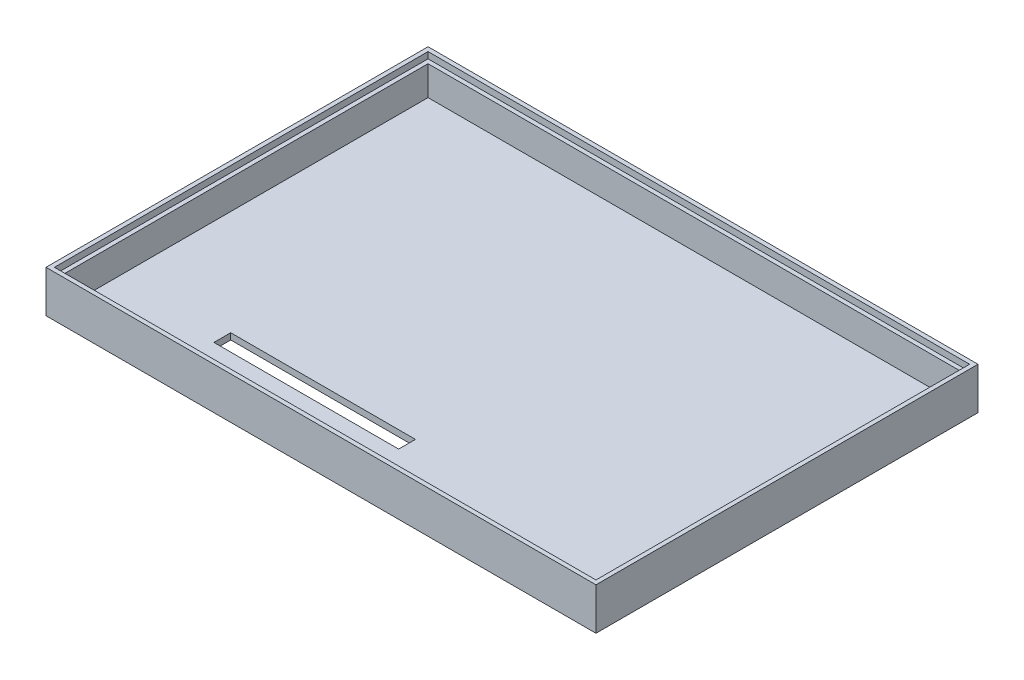
ISO-10303-21;
HEADER;
FILE_DESCRIPTION(('STEP AP214'),'2;1');
FILE_NAME('part.step','',(''),(''),'','','');
FILE_SCHEMA(('AUTOMOTIVE_DESIGN { 1 0 10303 214 1 1 1 1 }'));
ENDSEC;
DATA;
#1=APPLICATION_CONTEXT('core data for automotive mechanical design processes');
#2=APPLICATION_PROTOCOL_DEFINITION('international standard','automotive_design',2000,#1);
#3=PRODUCT_CONTEXT('',#1,'mechanical');
#4=PRODUCT('Part','Part','',(#3));
#5=PRODUCT_RELATED_PRODUCT_CATEGORY('part','',(#4));
#6=PRODUCT_DEFINITION_FORMATION('','',#4);
#7=PRODUCT_DEFINITION_CONTEXT('part definition',#1,'design');
#8=PRODUCT_DEFINITION('design','',#6,#7);
#9=PRODUCT_DEFINITION_SHAPE('','',#8);
#10=(LENGTH_UNIT() NAMED_UNIT(*) SI_UNIT(.MILLI.,.METRE.));
#11=(NAMED_UNIT(*) PLANE_ANGLE_UNIT() SI_UNIT($,.RADIAN.));
#12=(NAMED_UNIT(*) SI_UNIT($,.STERADIAN.) SOLID_ANGLE_UNIT());
#13=UNCERTAINTY_MEASURE_WITH_UNIT(LENGTH_MEASURE(1.E-05),#10,'distance_accuracy_value','');
#14=(GEOMETRIC_REPRESENTATION_CONTEXT(3) GLOBAL_UNCERTAINTY_ASSIGNED_CONTEXT((#13)) GLOBAL_UNIT_ASSIGNED_CONTEXT((#10,
#11,#12)) REPRESENTATION_CONTEXT('',''));
#15=CARTESIAN_POINT('',(0.,0.,0.));
#16=DIRECTION('',(0.,0.,1.));
#17=DIRECTION('',(1.,0.,0.));
#18=AXIS2_PLACEMENT_3D('',#15,#16,#17);
#19=CARTESIAN_POINT('',(-63.5,10.,-43.5));
#20=DIRECTION('',(1.,0.,0.));
#21=DIRECTION('',(0.,0.,-1.));
#22=AXIS2_PLACEMENT_3D('',#19,#20,#21);
#23=PLANE('',#22);
#24=DIRECTION('',(0.,-1.,0.));
#25=VECTOR('',#24,1.);
#26=CARTESIAN_POINT('',(-63.5,10.,-43.5));
#27=LINE('',#26,#25);
#28=CARTESIAN_POINT('',(-63.5,8.5,-43.5));
#29=VERTEX_POINT('',#28);
#30=CARTESIAN_POINT('',(-63.5,1.5,-43.5));
#31=VERTEX_POINT('',#30);
#32=EDGE_CURVE('E158',#29,#31,#27,.T.);
#33=ORIENTED_EDGE('',*,*,#32,.F.);
#34=DIRECTION('',(0.,0.,1.));
#35=VECTOR('',#34,1.);
#36=CARTESIAN_POINT('',(-63.5,8.5,-43.5));
#37=LINE('',#36,#35);
#38=CARTESIAN_POINT('',(-63.5,8.5,43.5));
#39=VERTEX_POINT('',#38);
#40=EDGE_CURVE('E48',#29,#39,#37,.T.);
#41=ORIENTED_EDGE('',*,*,#40,.T.);
#42=DIRECTION('',(0.,-1.,0.));
#43=VECTOR('',#42,1.);
#44=CARTESIAN_POINT('',(-63.5,10.,43.5));
#45=LINE('',#44,#43);
#46=CARTESIAN_POINT('',(-63.5,1.5,43.5));
#47=VERTEX_POINT('',#46);
#48=EDGE_CURVE('E156',#39,#47,#45,.T.);
#49=ORIENTED_EDGE('',*,*,#48,.T.);
#50=DIRECTION('',(0.,0.,1.));
#51=VECTOR('',#50,1.);
#52=CARTESIAN_POINT('',(-63.5,1.5,43.5));
#53=LINE('',#52,#51);
#54=EDGE_CURVE('E41',#31,#47,#53,.T.);
#55=ORIENTED_EDGE('',*,*,#54,.F.);
#56=EDGE_LOOP('',(#33,#41,#49,#55));
#57=FACE_BOUND('',#56,.T.);
#58=ADVANCED_FACE('F33',(#57),#23,.T.);
#59=CARTESIAN_POINT('',(-63.5,10.,43.5));
#60=DIRECTION('',(0.,0.,-1.));
#61=DIRECTION('',(-1.,0.,0.));
#62=AXIS2_PLACEMENT_3D('',#59,#60,#61);
#63=PLANE('',#62);
#64=ORIENTED_EDGE('',*,*,#48,.F.);
#65=DIRECTION('',(1.,0.,0.));
#66=VECTOR('',#65,1.);
#67=CARTESIAN_POINT('',(-63.5,8.5,43.5));
#68=LINE('',#67,#66);
#69=CARTESIAN_POINT('',(63.5,8.5,43.5));
#70=VERTEX_POINT('',#69);
#71=EDGE_CURVE('E144',#39,#70,#68,.T.);
#72=ORIENTED_EDGE('',*,*,#71,.T.);
#73=DIRECTION('',(0.,-1.,0.));
#74=VECTOR('',#73,1.);
#75=CARTESIAN_POINT('',(63.5,10.,43.5));
#76=LINE('',#75,#74);
#77=CARTESIAN_POINT('',(63.5,1.5,43.5));
#78=VERTEX_POINT('',#77);
#79=EDGE_CURVE('E163',#70,#78,#76,.T.);
#80=ORIENTED_EDGE('',*,*,#79,.T.);
#81=DIRECTION('',(1.,0.,0.));
#82=VECTOR('',#81,1.);
#83=CARTESIAN_POINT('',(-63.5,1.5,43.5));
#84=LINE('',#83,#82);
#85=EDGE_CURVE('E11',#47,#78,#84,.T.);
#86=ORIENTED_EDGE('',*,*,#85,.F.);
#87=EDGE_LOOP('',(#64,#72,#80,#86));
#88=FACE_BOUND('',#87,.T.);
#89=ADVANCED_FACE('F160',(#88),#63,.T.);
#90=CARTESIAN_POINT('',(63.5,10.,43.5));
#91=DIRECTION('',(-1.,0.,0.));
#92=DIRECTION('',(0.,0.,1.));
#93=AXIS2_PLACEMENT_3D('',#90,#91,#92);
#94=PLANE('',#93);
#95=ORIENTED_EDGE('',*,*,#79,.F.);
#96=DIRECTION('',(0.,0.,-1.));
#97=VECTOR('',#96,1.);
#98=CARTESIAN_POINT('',(63.5,8.5,43.5));
#99=LINE('',#98,#97);
#100=CARTESIAN_POINT('',(63.5,8.5,-43.5));
#101=VERTEX_POINT('',#100);
#102=EDGE_CURVE('E148',#70,#101,#99,.T.);
#103=ORIENTED_EDGE('',*,*,#102,.T.);
#104=DIRECTION('',(0.,-1.,0.));
#105=VECTOR('',#104,1.);
#106=CARTESIAN_POINT('',(63.5,10.,-43.5));
#107=LINE('',#106,#105);
#108=CARTESIAN_POINT('',(63.5,1.5,-43.5));
#109=VERTEX_POINT('',#108);
#110=EDGE_CURVE('E168',#101,#109,#107,.T.);
#111=ORIENTED_EDGE('',*,*,#110,.T.);
#112=DIRECTION('',(0.,0.,-1.));
#113=VECTOR('',#112,1.);
#114=CARTESIAN_POINT('',(63.5,1.5,43.5));
#115=LINE('',#114,#113);
#116=EDGE_CURVE('E198',#78,#109,#115,.T.);
#117=ORIENTED_EDGE('',*,*,#116,.F.);
#118=EDGE_LOOP('',(#95,#103,#111,#117));
#119=FACE_BOUND('',#118,.T.);
#120=ADVANCED_FACE('F276',(#119),#94,.T.);
#121=CARTESIAN_POINT('',(63.5,10.,-43.5));
#122=DIRECTION('',(0.,0.,1.));
#123=DIRECTION('',(1.,0.,0.));
#124=AXIS2_PLACEMENT_3D('',#121,#122,#123);
#125=PLANE('',#124);
#126=ORIENTED_EDGE('',*,*,#110,.F.);
#127=DIRECTION('',(-1.,0.,0.));
#128=VECTOR('',#127,1.);
#129=CARTESIAN_POINT('',(63.5,8.5,-43.5));
#130=LINE('',#129,#128);
#131=EDGE_CURVE('E210',#101,#29,#130,.T.);
#132=ORIENTED_EDGE('',*,*,#131,.T.);
#133=ORIENTED_EDGE('',*,*,#32,.T.);
#134=DIRECTION('',(-1.,0.,0.));
#135=VECTOR('',#134,1.);
#136=CARTESIAN_POINT('',(-63.5,1.5,-43.5));
#137=LINE('',#136,#135);
#138=EDGE_CURVE('E201',#109,#31,#137,.T.);
#139=ORIENTED_EDGE('',*,*,#138,.F.);
#140=EDGE_LOOP('',(#126,#132,#133,#139));
#141=FACE_BOUND('',#140,.T.);
#142=ADVANCED_FACE('F209',(#141),#125,.T.);
#143=CARTESIAN_POINT('',(0.,1.5,0.));
#144=DIRECTION('',(0.,-1.,0.));
#145=DIRECTION('',(0.,0.,-1.));
#146=AXIS2_PLACEMENT_3D('',#143,#144,#145);
#147=PLANE('',#146);
#148=DIRECTION('',(-1.,0.,0.));
#149=VECTOR('',#148,1.);
#150=CARTESIAN_POINT('',(-38.5,1.5,28.5));
#151=LINE('',#150,#149);
#152=CARTESIAN_POINT('',(5.49999999999998,1.5,28.5));
#153=VERTEX_POINT('',#152);
#154=CARTESIAN_POINT('',(-38.5,1.5,28.5));
#155=VERTEX_POINT('',#154);
#156=EDGE_CURVE('E239',#153,#155,#151,.T.);
#157=ORIENTED_EDGE('',*,*,#156,.F.);
#158=DIRECTION('',(0.,0.,-1.));
#159=VECTOR('',#158,1.);
#160=CARTESIAN_POINT('',(5.49999999999998,1.5,32.5));
#161=LINE('',#160,#159);
#162=CARTESIAN_POINT('',(5.49999999999998,1.5,32.5));
#163=VERTEX_POINT('',#162);
#164=EDGE_CURVE('E236',#163,#153,#161,.T.);
#165=ORIENTED_EDGE('',*,*,#164,.F.);
#166=DIRECTION('',(1.,0.,0.));
#167=VECTOR('',#166,1.);
#168=CARTESIAN_POINT('',(-38.5,1.5,32.5));
#169=LINE('',#168,#167);
#170=CARTESIAN_POINT('',(-38.5,1.5,32.5));
#171=VERTEX_POINT('',#170);
#172=EDGE_CURVE('E211',#171,#163,#169,.T.);
#173=ORIENTED_EDGE('',*,*,#172,.F.);
#174=DIRECTION('',(0.,0.,1.));
#175=VECTOR('',#174,1.);
#176=CARTESIAN_POINT('',(-38.5,1.5,32.5));
#177=LINE('',#176,#175);
#178=EDGE_CURVE('E242',#155,#171,#177,.T.);
#179=ORIENTED_EDGE('',*,*,#178,.F.);
#180=EDGE_LOOP('',(#157,#165,#173,#179));
#181=FACE_BOUND('',#180,.T.);
#182=ORIENTED_EDGE('',*,*,#116,.T.);
#183=ORIENTED_EDGE('',*,*,#138,.T.);
#184=ORIENTED_EDGE('',*,*,#54,.T.);
#185=ORIENTED_EDGE('',*,*,#85,.T.);
#186=EDGE_LOOP('',(#182,#183,#184,#185));
#187=FACE_BOUND('',#186,.T.);
#188=ADVANCED_FACE('F204',(#181,#187),#147,.F.);
#189=CARTESIAN_POINT('',(0.,10.,0.));
#190=DIRECTION('',(0.,1.,0.));
#191=DIRECTION('',(0.,0.,1.));
#192=AXIS2_PLACEMENT_3D('',#189,#190,#191);
#193=PLANE('',#192);
#194=DIRECTION('',(0.,0.,-1.));
#195=VECTOR('',#194,1.);
#196=CARTESIAN_POINT('',(64.5,10.,44.5));
#197=LINE('',#196,#195);
#198=CARTESIAN_POINT('',(64.5,10.,44.5));
#199=VERTEX_POINT('',#198);
#200=CARTESIAN_POINT('',(64.5,10.,-44.5));
#201=VERTEX_POINT('',#200);
#202=EDGE_CURVE('E56',#199,#201,#197,.T.);
#203=ORIENTED_EDGE('',*,*,#202,.F.);
#204=DIRECTION('',(1.,0.,0.));
#205=VECTOR('',#204,1.);
#206=CARTESIAN_POINT('',(-64.5,10.,44.5));
#207=LINE('',#206,#205);
#208=CARTESIAN_POINT('',(-64.5,10.,44.5));
#209=VERTEX_POINT('',#208);
#210=EDGE_CURVE('E253',#209,#199,#207,.T.);
#211=ORIENTED_EDGE('',*,*,#210,.F.);
#212=DIRECTION('',(0.,0.,1.));
#213=VECTOR('',#212,1.);
#214=CARTESIAN_POINT('',(-64.5,10.,-44.5));
#215=LINE('',#214,#213);
#216=CARTESIAN_POINT('',(-64.5,10.,-44.5));
#217=VERTEX_POINT('',#216);
#218=EDGE_CURVE('E257',#217,#209,#215,.T.);
#219=ORIENTED_EDGE('',*,*,#218,.F.);
#220=DIRECTION('',(-1.,0.,0.));
#221=VECTOR('',#220,1.);
#222=CARTESIAN_POINT('',(64.5,10.,-44.5));
#223=LINE('',#222,#221);
#224=EDGE_CURVE('E260',#201,#217,#223,.T.);
#225=ORIENTED_EDGE('',*,*,#224,.F.);
#226=EDGE_LOOP('',(#203,#211,#219,#225));
#227=FACE_BOUND('',#226,.T.);
#228=DIRECTION('',(-1.,0.,0.));
#229=VECTOR('',#228,1.);
#230=CARTESIAN_POINT('',(65.5,10.,-45.5));
#231=LINE('',#230,#229);
#232=CARTESIAN_POINT('',(65.5,10.,-45.5));
#233=VERTEX_POINT('',#232);
#234=CARTESIAN_POINT('',(-65.5,10.,-45.5));
#235=VERTEX_POINT('',#234);
#236=EDGE_CURVE('E172',#233,#235,#231,.T.);
#237=ORIENTED_EDGE('',*,*,#236,.T.);
#238=DIRECTION('',(0.,0.,1.));
#239=VECTOR('',#238,1.);
#240=CARTESIAN_POINT('',(-65.5,10.,-45.5));
#241=LINE('',#240,#239);
#242=CARTESIAN_POINT('',(-65.5,10.,45.5));
#243=VERTEX_POINT('',#242);
#244=EDGE_CURVE('E175',#235,#243,#241,.T.);
#245=ORIENTED_EDGE('',*,*,#244,.T.);
#246=DIRECTION('',(1.,0.,0.));
#247=VECTOR('',#246,1.);
#248=CARTESIAN_POINT('',(-65.5,10.,45.5));
#249=LINE('',#248,#247);
#250=CARTESIAN_POINT('',(65.5,10.,45.5));
#251=VERTEX_POINT('',#250);
#252=EDGE_CURVE('E178',#243,#251,#249,.T.);
#253=ORIENTED_EDGE('',*,*,#252,.T.);
#254=DIRECTION('',(0.,0.,-1.));
#255=VECTOR('',#254,1.);
#256=CARTESIAN_POINT('',(65.5,10.,45.5));
#257=LINE('',#256,#255);
#258=EDGE_CURVE('E180',#251,#233,#257,.T.);
#259=ORIENTED_EDGE('',*,*,#258,.T.);
#260=EDGE_LOOP('',(#237,#245,#253,#259));
#261=FACE_BOUND('',#260,.T.);
#262=ADVANCED_FACE('F291',(#227,#261),#193,.T.);
#263=CARTESIAN_POINT('',(65.5,10.,-45.5));
#264=DIRECTION('',(0.,0.,1.));
#265=DIRECTION('',(1.,0.,0.));
#266=AXIS2_PLACEMENT_3D('',#263,#264,#265);
#267=PLANE('',#266);
#268=DIRECTION('',(-1.,0.,0.));
#269=VECTOR('',#268,1.);
#270=CARTESIAN_POINT('',(65.5,0.,-45.5));
#271=LINE('',#270,#269);
#272=CARTESIAN_POINT('',(65.5,0.,-45.5));
#273=VERTEX_POINT('',#272);
#274=CARTESIAN_POINT('',(-65.5,0.,-45.5));
#275=VERTEX_POINT('',#274);
#276=EDGE_CURVE('E162',#273,#275,#271,.T.);
#277=ORIENTED_EDGE('',*,*,#276,.T.);
#278=DIRECTION('',(0.,-1.,0.));
#279=VECTOR('',#278,1.);
#280=CARTESIAN_POINT('',(-65.5,10.,-45.5));
#281=LINE('',#280,#279);
#282=EDGE_CURVE('E195',#235,#275,#281,.T.);
#283=ORIENTED_EDGE('',*,*,#282,.F.);
#284=ORIENTED_EDGE('',*,*,#236,.F.);
#285=DIRECTION('',(0.,-1.,0.));
#286=VECTOR('',#285,1.);
#287=CARTESIAN_POINT('',(65.5,10.,-45.5));
#288=LINE('',#287,#286);
#289=EDGE_CURVE('E181',#233,#273,#288,.T.);
#290=ORIENTED_EDGE('',*,*,#289,.T.);
#291=EDGE_LOOP('',(#277,#283,#284,#290));
#292=FACE_BOUND('',#291,.T.);
#293=ADVANCED_FACE('F294',(#292),#267,.F.);
#294=CARTESIAN_POINT('',(-65.5,10.,-45.5));
#295=DIRECTION('',(1.,0.,0.));
#296=DIRECTION('',(0.,0.,-1.));
#297=AXIS2_PLACEMENT_3D('',#294,#295,#296);
#298=PLANE('',#297);
#299=DIRECTION('',(0.,0.,1.));
#300=VECTOR('',#299,1.);
#301=CARTESIAN_POINT('',(-65.5,0.,-45.5));
#302=LINE('',#301,#300);
#303=CARTESIAN_POINT('',(-65.5,0.,45.5));
#304=VERTEX_POINT('',#303);
#305=EDGE_CURVE('E166',#275,#304,#302,.T.);
#306=ORIENTED_EDGE('',*,*,#305,.T.);
#307=DIRECTION('',(0.,-1.,0.));
#308=VECTOR('',#307,1.);
#309=CARTESIAN_POINT('',(-65.5,10.,45.5));
#310=LINE('',#309,#308);
#311=EDGE_CURVE('E192',#243,#304,#310,.T.);
#312=ORIENTED_EDGE('',*,*,#311,.F.);
#313=ORIENTED_EDGE('',*,*,#244,.F.);
#314=ORIENTED_EDGE('',*,*,#282,.T.);
#315=EDGE_LOOP('',(#306,#312,#313,#314));
#316=FACE_BOUND('',#315,.T.);
#317=ADVANCED_FACE('F303',(#316),#298,.F.);
#318=CARTESIAN_POINT('',(-65.5,10.,45.5));
#319=DIRECTION('',(0.,0.,-1.));
#320=DIRECTION('',(-1.,0.,0.));
#321=AXIS2_PLACEMENT_3D('',#318,#319,#320);
#322=PLANE('',#321);
#323=DIRECTION('',(1.,0.,0.));
#324=VECTOR('',#323,1.);
#325=CARTESIAN_POINT('',(-65.5,0.,45.5));
#326=LINE('',#325,#324);
#327=CARTESIAN_POINT('',(65.5,0.,45.5));
#328=VERTEX_POINT('',#327);
#329=EDGE_CURVE('E184',#304,#328,#326,.T.);
#330=ORIENTED_EDGE('',*,*,#329,.T.);
#331=DIRECTION('',(0.,-1.,0.));
#332=VECTOR('',#331,1.);
#333=CARTESIAN_POINT('',(65.5,10.,45.5));
#334=LINE('',#333,#332);
#335=EDGE_CURVE('E189',#251,#328,#334,.T.);
#336=ORIENTED_EDGE('',*,*,#335,.F.);
#337=ORIENTED_EDGE('',*,*,#252,.F.);
#338=ORIENTED_EDGE('',*,*,#311,.T.);
#339=EDGE_LOOP('',(#330,#336,#337,#338));
#340=FACE_BOUND('',#339,.T.);
#341=ADVANCED_FACE('F299',(#340),#322,.F.);
#342=CARTESIAN_POINT('',(65.5,10.,45.5));
#343=DIRECTION('',(-1.,0.,0.));
#344=DIRECTION('',(0.,0.,1.));
#345=AXIS2_PLACEMENT_3D('',#342,#343,#344);
#346=PLANE('',#345);
#347=DIRECTION('',(0.,0.,-1.));
#348=VECTOR('',#347,1.);
#349=CARTESIAN_POINT('',(65.5,0.,45.5));
#350=LINE('',#349,#348);
#351=EDGE_CURVE('E176',#328,#273,#350,.T.);
#352=ORIENTED_EDGE('',*,*,#351,.T.);
#353=ORIENTED_EDGE('',*,*,#289,.F.);
#354=ORIENTED_EDGE('',*,*,#258,.F.);
#355=ORIENTED_EDGE('',*,*,#335,.T.);
#356=EDGE_LOOP('',(#352,#353,#354,#355));
#357=FACE_BOUND('',#356,.T.);
#358=ADVANCED_FACE('F296',(#357),#346,.F.);
#359=CARTESIAN_POINT('',(0.,0.,0.));
#360=DIRECTION('',(0.,-1.,0.));
#361=DIRECTION('',(0.,0.,-1.));
#362=AXIS2_PLACEMENT_3D('',#359,#360,#361);
#363=PLANE('',#362);
#364=DIRECTION('',(0.,0.,1.));
#365=VECTOR('',#364,1.);
#366=CARTESIAN_POINT('',(5.49999999999998,0.,32.5));
#367=LINE('',#366,#365);
#368=CARTESIAN_POINT('',(5.49999999999998,0.,28.5));
#369=VERTEX_POINT('',#368);
#370=CARTESIAN_POINT('',(5.49999999999998,0.,32.5));
#371=VERTEX_POINT('',#370);
#372=EDGE_CURVE('E234',#369,#371,#367,.T.);
#373=ORIENTED_EDGE('',*,*,#372,.F.);
#374=DIRECTION('',(1.,0.,0.));
#375=VECTOR('',#374,1.);
#376=CARTESIAN_POINT('',(-38.5,0.,28.5));
#377=LINE('',#376,#375);
#378=CARTESIAN_POINT('',(-38.5,0.,28.5));
#379=VERTEX_POINT('',#378);
#380=EDGE_CURVE('E221',#379,#369,#377,.T.);
#381=ORIENTED_EDGE('',*,*,#380,.F.);
#382=DIRECTION('',(0.,0.,-1.));
#383=VECTOR('',#382,1.);
#384=CARTESIAN_POINT('',(-38.5,0.,32.5));
#385=LINE('',#384,#383);
#386=CARTESIAN_POINT('',(-38.5,0.,32.5));
#387=VERTEX_POINT('',#386);
#388=EDGE_CURVE('E228',#387,#379,#385,.T.);
#389=ORIENTED_EDGE('',*,*,#388,.F.);
#390=DIRECTION('',(-1.,0.,0.));
#391=VECTOR('',#390,1.);
#392=CARTESIAN_POINT('',(-38.5,0.,32.5));
#393=LINE('',#392,#391);
#394=EDGE_CURVE('E231',#371,#387,#393,.T.);
#395=ORIENTED_EDGE('',*,*,#394,.F.);
#396=EDGE_LOOP('',(#373,#381,#389,#395));
#397=FACE_BOUND('',#396,.T.);
#398=ORIENTED_EDGE('',*,*,#276,.F.);
#399=ORIENTED_EDGE('',*,*,#351,.F.);
#400=ORIENTED_EDGE('',*,*,#329,.F.);
#401=ORIENTED_EDGE('',*,*,#305,.F.);
#402=EDGE_LOOP('',(#398,#399,#400,#401));
#403=FACE_BOUND('',#402,.T.);
#404=ADVANCED_FACE('F35',(#397,#403),#363,.T.);
#405=CARTESIAN_POINT('',(5.49999999999998,10.001,32.5));
#406=DIRECTION('',(1.,0.,0.));
#407=DIRECTION('',(0.,0.,-1.));
#408=AXIS2_PLACEMENT_3D('',#405,#406,#407);
#409=PLANE('',#408);
#410=ORIENTED_EDGE('',*,*,#164,.T.);
#411=DIRECTION('',(0.,-1.,0.));
#412=VECTOR('',#411,1.);
#413=CARTESIAN_POINT('',(5.49999999999998,10.001,28.5));
#414=LINE('',#413,#412);
#415=EDGE_CURVE('E214',#153,#369,#414,.T.);
#416=ORIENTED_EDGE('',*,*,#415,.T.);
#417=ORIENTED_EDGE('',*,*,#372,.T.);
#418=DIRECTION('',(0.,-1.,0.));
#419=VECTOR('',#418,1.);
#420=CARTESIAN_POINT('',(5.49999999999998,10.001,32.5));
#421=LINE('',#420,#419);
#422=EDGE_CURVE('E217',#163,#371,#421,.T.);
#423=ORIENTED_EDGE('',*,*,#422,.F.);
#424=EDGE_LOOP('',(#410,#416,#417,#423));
#425=FACE_BOUND('',#424,.T.);
#426=ADVANCED_FACE('F325',(#425),#409,.F.);
#427=CARTESIAN_POINT('',(-38.5,10.001,28.5));
#428=DIRECTION('',(0.,0.,-1.));
#429=DIRECTION('',(-1.,0.,0.));
#430=AXIS2_PLACEMENT_3D('',#427,#428,#429);
#431=PLANE('',#430);
#432=ORIENTED_EDGE('',*,*,#156,.T.);
#433=DIRECTION('',(0.,-1.,0.));
#434=VECTOR('',#433,1.);
#435=CARTESIAN_POINT('',(-38.5,10.001,28.5));
#436=LINE('',#435,#434);
#437=EDGE_CURVE('E223',#155,#379,#436,.T.);
#438=ORIENTED_EDGE('',*,*,#437,.T.);
#439=ORIENTED_EDGE('',*,*,#380,.T.);
#440=ORIENTED_EDGE('',*,*,#415,.F.);
#441=EDGE_LOOP('',(#432,#438,#439,#440));
#442=FACE_BOUND('',#441,.T.);
#443=ADVANCED_FACE('F321',(#442),#431,.F.);
#444=CARTESIAN_POINT('',(-38.5,10.001,32.5));
#445=DIRECTION('',(-1.,0.,0.));
#446=DIRECTION('',(0.,0.,1.));
#447=AXIS2_PLACEMENT_3D('',#444,#445,#446);
#448=PLANE('',#447);
#449=ORIENTED_EDGE('',*,*,#178,.T.);
#450=DIRECTION('',(0.,-1.,0.));
#451=VECTOR('',#450,1.);
#452=CARTESIAN_POINT('',(-38.5,10.001,32.5));
#453=LINE('',#452,#451);
#454=EDGE_CURVE('E220',#171,#387,#453,.T.);
#455=ORIENTED_EDGE('',*,*,#454,.T.);
#456=ORIENTED_EDGE('',*,*,#388,.T.);
#457=ORIENTED_EDGE('',*,*,#437,.F.);
#458=EDGE_LOOP('',(#449,#455,#456,#457));
#459=FACE_BOUND('',#458,.T.);
#460=ADVANCED_FACE('F332',(#459),#448,.F.);
#461=CARTESIAN_POINT('',(-38.5,10.001,32.5));
#462=DIRECTION('',(0.,0.,1.));
#463=DIRECTION('',(1.,0.,0.));
#464=AXIS2_PLACEMENT_3D('',#461,#462,#463);
#465=PLANE('',#464);
#466=ORIENTED_EDGE('',*,*,#172,.T.);
#467=ORIENTED_EDGE('',*,*,#422,.T.);
#468=ORIENTED_EDGE('',*,*,#394,.T.);
#469=ORIENTED_EDGE('',*,*,#454,.F.);
#470=EDGE_LOOP('',(#466,#467,#468,#469));
#471=FACE_BOUND('',#470,.T.);
#472=ADVANCED_FACE('F329',(#471),#465,.F.);
#473=CARTESIAN_POINT('',(64.5,8.5,44.5));
#474=DIRECTION('',(1.,0.,0.));
#475=DIRECTION('',(0.,0.,-1.));
#476=AXIS2_PLACEMENT_3D('',#473,#474,#475);
#477=PLANE('',#476);
#478=ORIENTED_EDGE('',*,*,#202,.T.);
#479=DIRECTION('',(0.,1.,0.));
#480=VECTOR('',#479,1.);
#481=CARTESIAN_POINT('',(64.5,8.5,-44.5));
#482=LINE('',#481,#480);
#483=CARTESIAN_POINT('',(64.5,8.5,-44.5));
#484=VERTEX_POINT('',#483);
#485=EDGE_CURVE('E245',#484,#201,#482,.T.);
#486=ORIENTED_EDGE('',*,*,#485,.F.);
#487=DIRECTION('',(0.,0.,-1.));
#488=VECTOR('',#487,1.);
#489=CARTESIAN_POINT('',(64.5,8.5,44.5));
#490=LINE('',#489,#488);
#491=CARTESIAN_POINT('',(64.5,8.5,44.5));
#492=VERTEX_POINT('',#491);
#493=EDGE_CURVE('E256',#492,#484,#490,.T.);
#494=ORIENTED_EDGE('',*,*,#493,.F.);
#495=DIRECTION('',(0.,1.,0.));
#496=VECTOR('',#495,1.);
#497=CARTESIAN_POINT('',(64.5,8.5,44.5));
#498=LINE('',#497,#496);
#499=EDGE_CURVE('E244',#492,#199,#498,.T.);
#500=ORIENTED_EDGE('',*,*,#499,.T.);
#501=EDGE_LOOP('',(#478,#486,#494,#500));
#502=FACE_BOUND('',#501,.T.);
#503=ADVANCED_FACE('F358',(#502),#477,.F.);
#504=CARTESIAN_POINT('',(-64.5,8.5,44.5));
#505=DIRECTION('',(0.,0.,1.));
#506=DIRECTION('',(1.,0.,0.));
#507=AXIS2_PLACEMENT_3D('',#504,#505,#506);
#508=PLANE('',#507);
#509=ORIENTED_EDGE('',*,*,#210,.T.);
#510=ORIENTED_EDGE('',*,*,#499,.F.);
#511=DIRECTION('',(1.,0.,0.));
#512=VECTOR('',#511,1.);
#513=CARTESIAN_POINT('',(-64.5,8.5,44.5));
#514=LINE('',#513,#512);
#515=CARTESIAN_POINT('',(-64.5,8.5,44.5));
#516=VERTEX_POINT('',#515);
#517=EDGE_CURVE('E248',#516,#492,#514,.T.);
#518=ORIENTED_EDGE('',*,*,#517,.F.);
#519=DIRECTION('',(0.,1.,0.));
#520=VECTOR('',#519,1.);
#521=CARTESIAN_POINT('',(-64.5,8.5,44.5));
#522=LINE('',#521,#520);
#523=EDGE_CURVE('E250',#516,#209,#522,.T.);
#524=ORIENTED_EDGE('',*,*,#523,.T.);
#525=EDGE_LOOP('',(#509,#510,#518,#524));
#526=FACE_BOUND('',#525,.T.);
#527=ADVANCED_FACE('F363',(#526),#508,.F.);
#528=CARTESIAN_POINT('',(-64.5,8.5,-44.5));
#529=DIRECTION('',(-1.,0.,0.));
#530=DIRECTION('',(0.,0.,1.));
#531=AXIS2_PLACEMENT_3D('',#528,#529,#530);
#532=PLANE('',#531);
#533=ORIENTED_EDGE('',*,*,#218,.T.);
#534=ORIENTED_EDGE('',*,*,#523,.F.);
#535=DIRECTION('',(0.,0.,1.));
#536=VECTOR('',#535,1.);
#537=CARTESIAN_POINT('',(-64.5,8.5,-44.5));
#538=LINE('',#537,#536);
#539=CARTESIAN_POINT('',(-64.5,8.5,-44.5));
#540=VERTEX_POINT('',#539);
#541=EDGE_CURVE('E266',#540,#516,#538,.T.);
#542=ORIENTED_EDGE('',*,*,#541,.F.);
#543=DIRECTION('',(0.,1.,0.));
#544=VECTOR('',#543,1.);
#545=CARTESIAN_POINT('',(-64.5,8.5,-44.5));
#546=LINE('',#545,#544);
#547=EDGE_CURVE('E247',#540,#217,#546,.T.);
#548=ORIENTED_EDGE('',*,*,#547,.T.);
#549=EDGE_LOOP('',(#533,#534,#542,#548));
#550=FACE_BOUND('',#549,.T.);
#551=ADVANCED_FACE('F367',(#550),#532,.F.);
#552=CARTESIAN_POINT('',(64.5,8.5,-44.5));
#553=DIRECTION('',(0.,0.,-1.));
#554=DIRECTION('',(-1.,0.,0.));
#555=AXIS2_PLACEMENT_3D('',#552,#553,#554);
#556=PLANE('',#555);
#557=ORIENTED_EDGE('',*,*,#224,.T.);
#558=ORIENTED_EDGE('',*,*,#547,.F.);
#559=DIRECTION('',(-1.,0.,0.));
#560=VECTOR('',#559,1.);
#561=CARTESIAN_POINT('',(64.5,8.5,-44.5));
#562=LINE('',#561,#560);
#563=EDGE_CURVE('E269',#484,#540,#562,.T.);
#564=ORIENTED_EDGE('',*,*,#563,.F.);
#565=ORIENTED_EDGE('',*,*,#485,.T.);
#566=EDGE_LOOP('',(#557,#558,#564,#565));
#567=FACE_BOUND('',#566,.T.);
#568=ADVANCED_FACE('F364',(#567),#556,.F.);
#569=CARTESIAN_POINT('',(0.,8.5,0.));
#570=DIRECTION('',(0.,1.,0.));
#571=DIRECTION('',(0.,0.,1.));
#572=AXIS2_PLACEMENT_3D('',#569,#570,#571);
#573=PLANE('',#572);
#574=ORIENTED_EDGE('',*,*,#131,.F.);
#575=ORIENTED_EDGE('',*,*,#102,.F.);
#576=ORIENTED_EDGE('',*,*,#71,.F.);
#577=ORIENTED_EDGE('',*,*,#40,.F.);
#578=EDGE_LOOP('',(#574,#575,#576,#577));
#579=FACE_BOUND('',#578,.T.);
#580=ORIENTED_EDGE('',*,*,#493,.T.);
#581=ORIENTED_EDGE('',*,*,#563,.T.);
#582=ORIENTED_EDGE('',*,*,#541,.T.);
#583=ORIENTED_EDGE('',*,*,#517,.T.);
#584=EDGE_LOOP('',(#580,#581,#582,#583));
#585=FACE_BOUND('',#584,.T.);
#586=ADVANCED_FACE('F145',(#579,#585),#573,.T.);
#587=CLOSED_SHELL('',(#58,#89,#120,#142,#188,#262,#293,#317,#341,#358,#404,#426,#443,#460,#472,
#503,#527,#551,#568,#586));
#588=MANIFOLD_SOLID_BREP('B2',#587);
#589=ADVANCED_BREP_SHAPE_REPRESENTATION('',(#18,#588),#14);
#590=SHAPE_DEFINITION_REPRESENTATION(#9,#589);
ENDSEC;
END-ISO-10303-21;
